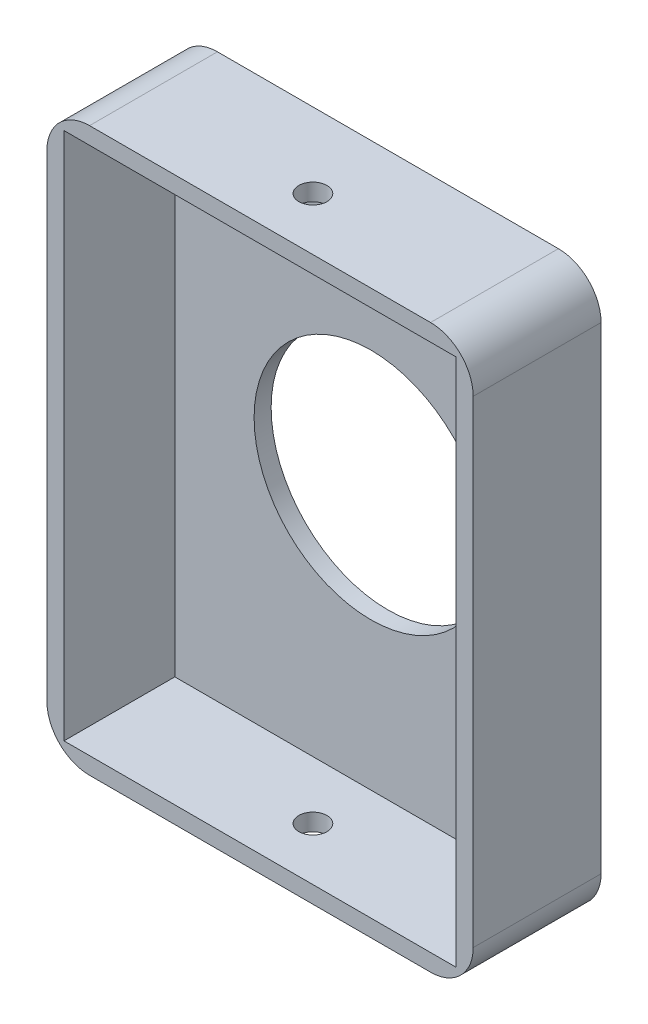
ISO-10303-21;
HEADER;
FILE_DESCRIPTION(('STEP AP214'),'2;1');
FILE_NAME('part.step','',(''),(''),'','','');
FILE_SCHEMA(('AUTOMOTIVE_DESIGN { 1 0 10303 214 1 1 1 1 }'));
ENDSEC;
DATA;
#1=APPLICATION_CONTEXT('core data for automotive mechanical design processes');
#2=APPLICATION_PROTOCOL_DEFINITION('international standard','automotive_design',2000,#1);
#3=PRODUCT_CONTEXT('',#1,'mechanical');
#4=PRODUCT('Part','Part','',(#3));
#5=PRODUCT_RELATED_PRODUCT_CATEGORY('part','',(#4));
#6=PRODUCT_DEFINITION_FORMATION('','',#4);
#7=PRODUCT_DEFINITION_CONTEXT('part definition',#1,'design');
#8=PRODUCT_DEFINITION('design','',#6,#7);
#9=PRODUCT_DEFINITION_SHAPE('','',#8);
#10=(LENGTH_UNIT() NAMED_UNIT(*) SI_UNIT(.MILLI.,.METRE.));
#11=(NAMED_UNIT(*) PLANE_ANGLE_UNIT() SI_UNIT($,.RADIAN.));
#12=(NAMED_UNIT(*) SI_UNIT($,.STERADIAN.) SOLID_ANGLE_UNIT());
#13=UNCERTAINTY_MEASURE_WITH_UNIT(LENGTH_MEASURE(1.E-05),#10,'distance_accuracy_value','');
#14=(GEOMETRIC_REPRESENTATION_CONTEXT(3) GLOBAL_UNCERTAINTY_ASSIGNED_CONTEXT((#13)) GLOBAL_UNIT_ASSIGNED_CONTEXT((#10,
#11,#12)) REPRESENTATION_CONTEXT('',''));
#15=CARTESIAN_POINT('',(0.,0.,0.));
#16=DIRECTION('',(0.,0.,1.));
#17=DIRECTION('',(1.,0.,0.));
#18=AXIS2_PLACEMENT_3D('',#15,#16,#17);
#19=CARTESIAN_POINT('',(0.,0.,19.05));
#20=DIRECTION('',(0.,0.,-1.));
#21=DIRECTION('',(-1.,0.,0.));
#22=AXIS2_PLACEMENT_3D('',#19,#20,#21);
#23=PLANE('',#22);
#24=DIRECTION('',(0.,1.,0.));
#25=VECTOR('',#24,1.);
#26=CARTESIAN_POINT('',(31.75,-41.91,19.05));
#27=LINE('',#26,#25);
#28=CARTESIAN_POINT('',(31.75,-35.56,19.05));
#29=VERTEX_POINT('',#28);
#30=CARTESIAN_POINT('',(31.75,35.56,19.05));
#31=VERTEX_POINT('',#30);
#32=EDGE_CURVE('E176',#29,#31,#27,.T.);
#33=ORIENTED_EDGE('',*,*,#32,.T.);
#34=CARTESIAN_POINT('',(25.4,35.56,19.05));
#35=DIRECTION('',(0.,0.,-1.));
#36=DIRECTION('',(-1.,0.,0.));
#37=AXIS2_PLACEMENT_3D('',#34,#35,#36);
#38=CIRCLE('',#37,6.35);
#39=CARTESIAN_POINT('',(25.4,41.91,19.05));
#40=VERTEX_POINT('',#39);
#41=EDGE_CURVE('E239',#31,#40,#38,.F.);
#42=ORIENTED_EDGE('',*,*,#41,.T.);
#43=DIRECTION('',(-1.,0.,0.));
#44=VECTOR('',#43,1.);
#45=CARTESIAN_POINT('',(-31.75,41.91,19.05));
#46=LINE('',#45,#44);
#47=CARTESIAN_POINT('',(-25.4,41.91,19.05));
#48=VERTEX_POINT('',#47);
#49=EDGE_CURVE('E180',#40,#48,#46,.T.);
#50=ORIENTED_EDGE('',*,*,#49,.T.);
#51=CARTESIAN_POINT('',(-25.4,35.56,19.05));
#52=DIRECTION('',(0.,0.,-1.));
#53=DIRECTION('',(-1.,0.,0.));
#54=AXIS2_PLACEMENT_3D('',#51,#52,#53);
#55=CIRCLE('',#54,6.35);
#56=CARTESIAN_POINT('',(-31.75,35.56,19.05));
#57=VERTEX_POINT('',#56);
#58=EDGE_CURVE('E231',#48,#57,#55,.F.);
#59=ORIENTED_EDGE('',*,*,#58,.T.);
#60=DIRECTION('',(0.,-1.,0.));
#61=VECTOR('',#60,1.);
#62=CARTESIAN_POINT('',(-31.75,-41.91,19.05));
#63=LINE('',#62,#61);
#64=CARTESIAN_POINT('',(-31.75,-35.56,19.05));
#65=VERTEX_POINT('',#64);
#66=EDGE_CURVE('E185',#57,#65,#63,.T.);
#67=ORIENTED_EDGE('',*,*,#66,.T.);
#68=CARTESIAN_POINT('',(-25.4,-35.56,19.05));
#69=DIRECTION('',(0.,0.,-1.));
#70=DIRECTION('',(-1.,0.,0.));
#71=AXIS2_PLACEMENT_3D('',#68,#69,#70);
#72=CIRCLE('',#71,6.35);
#73=CARTESIAN_POINT('',(-25.4,-41.91,19.05));
#74=VERTEX_POINT('',#73);
#75=EDGE_CURVE('E62',#65,#74,#72,.F.);
#76=ORIENTED_EDGE('',*,*,#75,.T.);
#77=DIRECTION('',(1.,0.,0.));
#78=VECTOR('',#77,1.);
#79=CARTESIAN_POINT('',(-31.75,-41.91,19.05));
#80=LINE('',#79,#78);
#81=CARTESIAN_POINT('',(25.4,-41.91,19.05));
#82=VERTEX_POINT('',#81);
#83=EDGE_CURVE('E188',#74,#82,#80,.T.);
#84=ORIENTED_EDGE('',*,*,#83,.T.);
#85=CARTESIAN_POINT('',(25.4,-35.56,19.05));
#86=DIRECTION('',(0.,0.,-1.));
#87=DIRECTION('',(-1.,0.,0.));
#88=AXIS2_PLACEMENT_3D('',#85,#86,#87);
#89=CIRCLE('',#88,6.35);
#90=EDGE_CURVE('E236',#82,#29,#89,.F.);
#91=ORIENTED_EDGE('',*,*,#90,.T.);
#92=EDGE_LOOP('',(#33,#42,#50,#59,#67,#76,#84,#91));
#93=FACE_BOUND('',#92,.T.);
#94=DIRECTION('',(0.,1.,0.));
#95=VECTOR('',#94,1.);
#96=CARTESIAN_POINT('',(29.21,0.,19.05));
#97=LINE('',#96,#95);
#98=CARTESIAN_POINT('',(29.21,-39.37,19.05));
#99=VERTEX_POINT('',#98);
#100=CARTESIAN_POINT('',(29.21,39.37,19.05));
#101=VERTEX_POINT('',#100);
#102=EDGE_CURVE('E160',#99,#101,#97,.T.);
#103=ORIENTED_EDGE('',*,*,#102,.F.);
#104=DIRECTION('',(1.,0.,0.));
#105=VECTOR('',#104,1.);
#106=CARTESIAN_POINT('',(0.,-39.37,19.05));
#107=LINE('',#106,#105);
#108=CARTESIAN_POINT('',(-29.21,-39.37,19.05));
#109=VERTEX_POINT('',#108);
#110=EDGE_CURVE('E173',#109,#99,#107,.T.);
#111=ORIENTED_EDGE('',*,*,#110,.F.);
#112=DIRECTION('',(0.,-1.,0.));
#113=VECTOR('',#112,1.);
#114=CARTESIAN_POINT('',(-29.21,0.,19.05));
#115=LINE('',#114,#113);
#116=CARTESIAN_POINT('',(-29.21,39.37,19.05));
#117=VERTEX_POINT('',#116);
#118=EDGE_CURVE('E170',#117,#109,#115,.T.);
#119=ORIENTED_EDGE('',*,*,#118,.F.);
#120=DIRECTION('',(-1.,0.,0.));
#121=VECTOR('',#120,1.);
#122=CARTESIAN_POINT('',(0.,39.37,19.05));
#123=LINE('',#122,#121);
#124=EDGE_CURVE('E146',#101,#117,#123,.T.);
#125=ORIENTED_EDGE('',*,*,#124,.F.);
#126=EDGE_LOOP('',(#103,#111,#119,#125));
#127=FACE_BOUND('',#126,.T.);
#128=ADVANCED_FACE('F38',(#93,#127),#23,.F.);
#129=CARTESIAN_POINT('',(31.75,-41.91,19.05));
#130=DIRECTION('',(-1.,0.,0.));
#131=DIRECTION('',(0.,0.,1.));
#132=AXIS2_PLACEMENT_3D('',#129,#130,#131);
#133=PLANE('',#132);
#134=DIRECTION('',(0.,1.,0.));
#135=VECTOR('',#134,1.);
#136=CARTESIAN_POINT('',(31.75,-41.91,0.));
#137=LINE('',#136,#135);
#138=CARTESIAN_POINT('',(31.75,-35.56,0.));
#139=VERTEX_POINT('',#138);
#140=CARTESIAN_POINT('',(31.75,35.56,0.));
#141=VERTEX_POINT('',#140);
#142=EDGE_CURVE('E192',#139,#141,#137,.T.);
#143=ORIENTED_EDGE('',*,*,#142,.T.);
#144=DIRECTION('',(0.,0.,-1.));
#145=VECTOR('',#144,1.);
#146=CARTESIAN_POINT('',(31.75,35.56,19.05));
#147=LINE('',#146,#145);
#148=EDGE_CURVE('E228',#141,#31,#147,.F.);
#149=ORIENTED_EDGE('',*,*,#148,.T.);
#150=ORIENTED_EDGE('',*,*,#32,.F.);
#151=DIRECTION('',(0.,0.,-1.));
#152=VECTOR('',#151,1.);
#153=CARTESIAN_POINT('',(31.75,-35.56,19.05));
#154=LINE('',#153,#152);
#155=EDGE_CURVE('E224',#29,#139,#154,.T.);
#156=ORIENTED_EDGE('',*,*,#155,.T.);
#157=EDGE_LOOP('',(#143,#149,#150,#156));
#158=FACE_BOUND('',#157,.T.);
#159=ADVANCED_FACE('F274',(#158),#133,.F.);
#160=CARTESIAN_POINT('',(-31.75,41.91,19.05));
#161=DIRECTION('',(0.,-1.,0.));
#162=DIRECTION('',(0.,0.,-1.));
#163=AXIS2_PLACEMENT_3D('',#160,#161,#162);
#164=PLANE('',#163);
#165=CARTESIAN_POINT('',(0.,41.91,11.176));
#166=DIRECTION('',(0.,-1.,0.));
#167=DIRECTION('',(0.,0.,-1.));
#168=AXIS2_PLACEMENT_3D('',#165,#166,#167);
#169=CIRCLE('',#168,2.0955);
#170=CARTESIAN_POINT('',(0.,41.91,13.2715));
#171=VERTEX_POINT('',#170);
#172=EDGE_CURVE('E453',#171,#171,#169,.T.);
#173=ORIENTED_EDGE('',*,*,#172,.T.);
#174=EDGE_LOOP('',(#173));
#175=FACE_BOUND('',#174,.T.);
#176=ORIENTED_EDGE('',*,*,#49,.F.);
#177=DIRECTION('',(0.,0.,-1.));
#178=VECTOR('',#177,1.);
#179=CARTESIAN_POINT('',(25.4,41.91,19.05));
#180=LINE('',#179,#178);
#181=CARTESIAN_POINT('',(25.4,41.91,0.));
#182=VERTEX_POINT('',#181);
#183=EDGE_CURVE('E208',#40,#182,#180,.T.);
#184=ORIENTED_EDGE('',*,*,#183,.T.);
#185=DIRECTION('',(-1.,0.,0.));
#186=VECTOR('',#185,1.);
#187=CARTESIAN_POINT('',(-31.75,41.91,0.));
#188=LINE('',#187,#186);
#189=CARTESIAN_POINT('',(-25.4,41.91,0.));
#190=VERTEX_POINT('',#189);
#191=EDGE_CURVE('E196',#182,#190,#188,.T.);
#192=ORIENTED_EDGE('',*,*,#191,.T.);
#193=DIRECTION('',(0.,0.,-1.));
#194=VECTOR('',#193,1.);
#195=CARTESIAN_POINT('',(-25.4,41.91,19.05));
#196=LINE('',#195,#194);
#197=EDGE_CURVE('E191',#190,#48,#196,.F.);
#198=ORIENTED_EDGE('',*,*,#197,.T.);
#199=EDGE_LOOP('',(#176,#184,#192,#198));
#200=FACE_BOUND('',#199,.T.);
#201=ADVANCED_FACE('F282',(#175,#200),#164,.F.);
#202=CARTESIAN_POINT('',(-31.75,-41.91,19.05));
#203=DIRECTION('',(1.,0.,0.));
#204=DIRECTION('',(0.,0.,-1.));
#205=AXIS2_PLACEMENT_3D('',#202,#203,#204);
#206=PLANE('',#205);
#207=DIRECTION('',(0.,-1.,0.));
#208=VECTOR('',#207,1.);
#209=CARTESIAN_POINT('',(-31.75,-41.91,0.));
#210=LINE('',#209,#208);
#211=CARTESIAN_POINT('',(-31.75,35.56,0.));
#212=VERTEX_POINT('',#211);
#213=CARTESIAN_POINT('',(-31.75,-35.56,0.));
#214=VERTEX_POINT('',#213);
#215=EDGE_CURVE('E200',#212,#214,#210,.T.);
#216=ORIENTED_EDGE('',*,*,#215,.T.);
#217=DIRECTION('',(0.,0.,-1.));
#218=VECTOR('',#217,1.);
#219=CARTESIAN_POINT('',(-31.75,-35.56,19.05));
#220=LINE('',#219,#218);
#221=EDGE_CURVE('E11',#214,#65,#220,.F.);
#222=ORIENTED_EDGE('',*,*,#221,.T.);
#223=ORIENTED_EDGE('',*,*,#66,.F.);
#224=DIRECTION('',(0.,0.,-1.));
#225=VECTOR('',#224,1.);
#226=CARTESIAN_POINT('',(-31.75,35.56,19.05));
#227=LINE('',#226,#225);
#228=EDGE_CURVE('E48',#57,#212,#227,.T.);
#229=ORIENTED_EDGE('',*,*,#228,.T.);
#230=EDGE_LOOP('',(#216,#222,#223,#229));
#231=FACE_BOUND('',#230,.T.);
#232=ADVANCED_FACE('F254',(#231),#206,.F.);
#233=CARTESIAN_POINT('',(-31.75,-41.91,19.05));
#234=DIRECTION('',(0.,1.,0.));
#235=DIRECTION('',(0.,0.,1.));
#236=AXIS2_PLACEMENT_3D('',#233,#234,#235);
#237=PLANE('',#236);
#238=CARTESIAN_POINT('',(0.,-41.91,11.176));
#239=DIRECTION('',(0.,1.,0.));
#240=DIRECTION('',(0.,0.,1.));
#241=AXIS2_PLACEMENT_3D('',#238,#239,#240);
#242=CIRCLE('',#241,2.0955);
#243=CARTESIAN_POINT('',(0.,-41.91,13.2715));
#244=VERTEX_POINT('',#243);
#245=EDGE_CURVE('E471',#244,#244,#242,.T.);
#246=ORIENTED_EDGE('',*,*,#245,.T.);
#247=EDGE_LOOP('',(#246));
#248=FACE_BOUND('',#247,.T.);
#249=DIRECTION('',(1.,0.,0.));
#250=VECTOR('',#249,1.);
#251=CARTESIAN_POINT('',(-31.75,-41.91,0.));
#252=LINE('',#251,#250);
#253=CARTESIAN_POINT('',(-25.4,-41.91,0.));
#254=VERTEX_POINT('',#253);
#255=CARTESIAN_POINT('',(25.4,-41.91,0.));
#256=VERTEX_POINT('',#255);
#257=EDGE_CURVE('E181',#254,#256,#252,.T.);
#258=ORIENTED_EDGE('',*,*,#257,.T.);
#259=DIRECTION('',(0.,0.,-1.));
#260=VECTOR('',#259,1.);
#261=CARTESIAN_POINT('',(25.4,-41.91,19.05));
#262=LINE('',#261,#260);
#263=EDGE_CURVE('E55',#256,#82,#262,.F.);
#264=ORIENTED_EDGE('',*,*,#263,.T.);
#265=ORIENTED_EDGE('',*,*,#83,.F.);
#266=DIRECTION('',(0.,0.,-1.));
#267=VECTOR('',#266,1.);
#268=CARTESIAN_POINT('',(-25.4,-41.91,19.05));
#269=LINE('',#268,#267);
#270=EDGE_CURVE('E242',#74,#254,#269,.T.);
#271=ORIENTED_EDGE('',*,*,#270,.T.);
#272=EDGE_LOOP('',(#258,#264,#265,#271));
#273=FACE_BOUND('',#272,.T.);
#274=ADVANCED_FACE('F265',(#248,#273),#237,.F.);
#275=CARTESIAN_POINT('',(0.,0.,0.));
#276=DIRECTION('',(0.,0.,-1.));
#277=DIRECTION('',(-1.,0.,0.));
#278=AXIS2_PLACEMENT_3D('',#275,#276,#277);
#279=PLANE('',#278);
#280=CARTESIAN_POINT('',(0.,0.,0.));
#281=DIRECTION('',(0.,0.,-1.));
#282=DIRECTION('',(-1.,0.,0.));
#283=AXIS2_PLACEMENT_3D('',#280,#281,#282);
#284=CIRCLE('',#283,17.399);
#285=CARTESIAN_POINT('',(-17.399,0.,0.));
#286=VERTEX_POINT('',#285);
#287=EDGE_CURVE('E447',#286,#286,#284,.F.);
#288=ORIENTED_EDGE('',*,*,#287,.T.);
#289=EDGE_LOOP('',(#288));
#290=FACE_BOUND('',#289,.T.);
#291=ORIENTED_EDGE('',*,*,#191,.F.);
#292=CARTESIAN_POINT('',(25.4,35.56,0.));
#293=DIRECTION('',(0.,0.,-1.));
#294=DIRECTION('',(-1.,0.,0.));
#295=AXIS2_PLACEMENT_3D('',#292,#293,#294);
#296=CIRCLE('',#295,6.35);
#297=EDGE_CURVE('E221',#182,#141,#296,.T.);
#298=ORIENTED_EDGE('',*,*,#297,.T.);
#299=ORIENTED_EDGE('',*,*,#142,.F.);
#300=CARTESIAN_POINT('',(25.4,-35.56,0.));
#301=DIRECTION('',(0.,0.,-1.));
#302=DIRECTION('',(-1.,0.,0.));
#303=AXIS2_PLACEMENT_3D('',#300,#301,#302);
#304=CIRCLE('',#303,6.35);
#305=EDGE_CURVE('E218',#139,#256,#304,.T.);
#306=ORIENTED_EDGE('',*,*,#305,.T.);
#307=ORIENTED_EDGE('',*,*,#257,.F.);
#308=CARTESIAN_POINT('',(-25.4,-35.56,0.));
#309=DIRECTION('',(0.,0.,-1.));
#310=DIRECTION('',(-1.,0.,0.));
#311=AXIS2_PLACEMENT_3D('',#308,#309,#310);
#312=CIRCLE('',#311,6.35);
#313=EDGE_CURVE('E215',#254,#214,#312,.T.);
#314=ORIENTED_EDGE('',*,*,#313,.T.);
#315=ORIENTED_EDGE('',*,*,#215,.F.);
#316=CARTESIAN_POINT('',(-25.4,35.56,0.));
#317=DIRECTION('',(0.,0.,-1.));
#318=DIRECTION('',(-1.,0.,0.));
#319=AXIS2_PLACEMENT_3D('',#316,#317,#318);
#320=CIRCLE('',#319,6.35);
#321=EDGE_CURVE('E212',#212,#190,#320,.T.);
#322=ORIENTED_EDGE('',*,*,#321,.T.);
#323=EDGE_LOOP('',(#291,#298,#299,#306,#307,#314,#315,#322));
#324=FACE_BOUND('',#323,.T.);
#325=ADVANCED_FACE('F260',(#290,#324),#279,.T.);
#326=CARTESIAN_POINT('',(29.21,-41.91,19.05));
#327=DIRECTION('',(-1.,0.,0.));
#328=DIRECTION('',(0.,0.,1.));
#329=AXIS2_PLACEMENT_3D('',#326,#327,#328);
#330=PLANE('',#329);
#331=DIRECTION('',(0.,1.,0.));
#332=VECTOR('',#331,1.);
#333=CARTESIAN_POINT('',(29.21,0.,2.54));
#334=LINE('',#333,#332);
#335=CARTESIAN_POINT('',(29.21,-39.37,2.54));
#336=VERTEX_POINT('',#335);
#337=CARTESIAN_POINT('',(29.21,39.37,2.54));
#338=VERTEX_POINT('',#337);
#339=EDGE_CURVE('E136',#336,#338,#334,.T.);
#340=ORIENTED_EDGE('',*,*,#339,.F.);
#341=DIRECTION('',(0.,0.,-1.));
#342=VECTOR('',#341,1.);
#343=CARTESIAN_POINT('',(29.21,-39.37,19.05));
#344=LINE('',#343,#342);
#345=EDGE_CURVE('E164',#99,#336,#344,.T.);
#346=ORIENTED_EDGE('',*,*,#345,.F.);
#347=ORIENTED_EDGE('',*,*,#102,.T.);
#348=DIRECTION('',(0.,0.,-1.));
#349=VECTOR('',#348,1.);
#350=CARTESIAN_POINT('',(29.21,39.37,19.05));
#351=LINE('',#350,#349);
#352=EDGE_CURVE('E151',#101,#338,#351,.T.);
#353=ORIENTED_EDGE('',*,*,#352,.T.);
#354=EDGE_LOOP('',(#340,#346,#347,#353));
#355=FACE_BOUND('',#354,.T.);
#356=ADVANCED_FACE('F304',(#355),#330,.T.);
#357=CARTESIAN_POINT('',(-31.75,39.37,19.05));
#358=DIRECTION('',(0.,-1.,0.));
#359=DIRECTION('',(0.,0.,-1.));
#360=AXIS2_PLACEMENT_3D('',#357,#358,#359);
#361=PLANE('',#360);
#362=CARTESIAN_POINT('',(0.,39.37,11.176));
#363=DIRECTION('',(0.,-1.,0.));
#364=DIRECTION('',(0.,0.,-1.));
#365=AXIS2_PLACEMENT_3D('',#362,#363,#364);
#366=CIRCLE('',#365,2.0955);
#367=CARTESIAN_POINT('',(0.,39.37,13.2715));
#368=VERTEX_POINT('',#367);
#369=EDGE_CURVE('E468',#368,#368,#366,.T.);
#370=ORIENTED_EDGE('',*,*,#369,.F.);
#371=EDGE_LOOP('',(#370));
#372=FACE_BOUND('',#371,.T.);
#373=DIRECTION('',(-1.,0.,0.));
#374=VECTOR('',#373,1.);
#375=CARTESIAN_POINT('',(0.,39.37,2.54));
#376=LINE('',#375,#374);
#377=CARTESIAN_POINT('',(-29.21,39.37,2.54));
#378=VERTEX_POINT('',#377);
#379=EDGE_CURVE('E129',#338,#378,#376,.T.);
#380=ORIENTED_EDGE('',*,*,#379,.F.);
#381=ORIENTED_EDGE('',*,*,#352,.F.);
#382=ORIENTED_EDGE('',*,*,#124,.T.);
#383=DIRECTION('',(0.,0.,-1.));
#384=VECTOR('',#383,1.);
#385=CARTESIAN_POINT('',(-29.21,39.37,19.05));
#386=LINE('',#385,#384);
#387=EDGE_CURVE('E143',#117,#378,#386,.T.);
#388=ORIENTED_EDGE('',*,*,#387,.T.);
#389=EDGE_LOOP('',(#380,#381,#382,#388));
#390=FACE_BOUND('',#389,.T.);
#391=ADVANCED_FACE('F144',(#372,#390),#361,.T.);
#392=CARTESIAN_POINT('',(-29.21,-41.91,19.05));
#393=DIRECTION('',(1.,0.,0.));
#394=DIRECTION('',(0.,0.,-1.));
#395=AXIS2_PLACEMENT_3D('',#392,#393,#394);
#396=PLANE('',#395);
#397=DIRECTION('',(0.,-1.,0.));
#398=VECTOR('',#397,1.);
#399=CARTESIAN_POINT('',(-29.21,0.,2.54));
#400=LINE('',#399,#398);
#401=CARTESIAN_POINT('',(-29.21,-39.37,2.54));
#402=VERTEX_POINT('',#401);
#403=EDGE_CURVE('E133',#378,#402,#400,.T.);
#404=ORIENTED_EDGE('',*,*,#403,.F.);
#405=ORIENTED_EDGE('',*,*,#387,.F.);
#406=ORIENTED_EDGE('',*,*,#118,.T.);
#407=DIRECTION('',(0.,0.,-1.));
#408=VECTOR('',#407,1.);
#409=CARTESIAN_POINT('',(-29.21,-39.37,19.05));
#410=LINE('',#409,#408);
#411=EDGE_CURVE('E152',#109,#402,#410,.T.);
#412=ORIENTED_EDGE('',*,*,#411,.T.);
#413=EDGE_LOOP('',(#404,#405,#406,#412));
#414=FACE_BOUND('',#413,.T.);
#415=ADVANCED_FACE('F154',(#414),#396,.T.);
#416=CARTESIAN_POINT('',(-31.75,-39.37,19.05));
#417=DIRECTION('',(0.,1.,0.));
#418=DIRECTION('',(0.,0.,1.));
#419=AXIS2_PLACEMENT_3D('',#416,#417,#418);
#420=PLANE('',#419);
#421=CARTESIAN_POINT('',(0.,-39.37,11.176));
#422=DIRECTION('',(0.,1.,0.));
#423=DIRECTION('',(0.,0.,1.));
#424=AXIS2_PLACEMENT_3D('',#421,#422,#423);
#425=CIRCLE('',#424,2.0955);
#426=CARTESIAN_POINT('',(0.,-39.37,13.2715));
#427=VERTEX_POINT('',#426);
#428=EDGE_CURVE('E42',#427,#427,#425,.T.);
#429=ORIENTED_EDGE('',*,*,#428,.F.);
#430=EDGE_LOOP('',(#429));
#431=FACE_BOUND('',#430,.T.);
#432=DIRECTION('',(1.,0.,0.));
#433=VECTOR('',#432,1.);
#434=CARTESIAN_POINT('',(0.,-39.37,2.54));
#435=LINE('',#434,#433);
#436=EDGE_CURVE('E157',#402,#336,#435,.T.);
#437=ORIENTED_EDGE('',*,*,#436,.F.);
#438=ORIENTED_EDGE('',*,*,#411,.F.);
#439=ORIENTED_EDGE('',*,*,#110,.T.);
#440=ORIENTED_EDGE('',*,*,#345,.T.);
#441=EDGE_LOOP('',(#437,#438,#439,#440));
#442=FACE_BOUND('',#441,.T.);
#443=ADVANCED_FACE('F354',(#431,#442),#420,.T.);
#444=CARTESIAN_POINT('',(0.,0.,2.54));
#445=DIRECTION('',(0.,0.,-1.));
#446=DIRECTION('',(-1.,0.,0.));
#447=AXIS2_PLACEMENT_3D('',#444,#445,#446);
#448=PLANE('',#447);
#449=CARTESIAN_POINT('',(0.,0.,2.54));
#450=DIRECTION('',(0.,0.,1.));
#451=DIRECTION('',(1.,0.,0.));
#452=AXIS2_PLACEMENT_3D('',#449,#450,#451);
#453=CIRCLE('',#452,17.399);
#454=CARTESIAN_POINT('',(17.399,0.,2.54));
#455=VERTEX_POINT('',#454);
#456=EDGE_CURVE('E444',#455,#455,#453,.T.);
#457=ORIENTED_EDGE('',*,*,#456,.F.);
#458=EDGE_LOOP('',(#457));
#459=FACE_BOUND('',#458,.T.);
#460=ORIENTED_EDGE('',*,*,#339,.T.);
#461=ORIENTED_EDGE('',*,*,#379,.T.);
#462=ORIENTED_EDGE('',*,*,#403,.T.);
#463=ORIENTED_EDGE('',*,*,#436,.T.);
#464=EDGE_LOOP('',(#460,#461,#462,#463));
#465=FACE_BOUND('',#464,.T.);
#466=ADVANCED_FACE('F131',(#459,#465),#448,.F.);
#467=CARTESIAN_POINT('',(0.,0.,-0.00100000000000013));
#468=DIRECTION('',(0.,0.,1.));
#469=DIRECTION('',(1.,0.,0.));
#470=AXIS2_PLACEMENT_3D('',#467,#468,#469);
#471=CYLINDRICAL_SURFACE('',#470,17.399);
#472=ORIENTED_EDGE('',*,*,#287,.F.);
#473=EDGE_LOOP('',(#472));
#474=FACE_BOUND('',#473,.T.);
#475=ORIENTED_EDGE('',*,*,#456,.T.);
#476=EDGE_LOOP('',(#475));
#477=FACE_BOUND('',#476,.T.);
#478=ADVANCED_FACE('F316',(#474,#477),#471,.F.);
#479=CARTESIAN_POINT('',(25.4,35.56,19.05));
#480=DIRECTION('',(0.,0.,-1.));
#481=DIRECTION('',(-1.,0.,0.));
#482=AXIS2_PLACEMENT_3D('',#479,#480,#481);
#483=CYLINDRICAL_SURFACE('',#482,6.35);
#484=ORIENTED_EDGE('',*,*,#41,.F.);
#485=ORIENTED_EDGE('',*,*,#148,.F.);
#486=ORIENTED_EDGE('',*,*,#297,.F.);
#487=ORIENTED_EDGE('',*,*,#183,.F.);
#488=EDGE_LOOP('',(#484,#485,#486,#487));
#489=FACE_BOUND('',#488,.T.);
#490=ADVANCED_FACE('F279',(#489),#483,.T.);
#491=CARTESIAN_POINT('',(25.4,-35.56,19.05));
#492=DIRECTION('',(0.,0.,-1.));
#493=DIRECTION('',(-1.,0.,0.));
#494=AXIS2_PLACEMENT_3D('',#491,#492,#493);
#495=CYLINDRICAL_SURFACE('',#494,6.35);
#496=ORIENTED_EDGE('',*,*,#90,.F.);
#497=ORIENTED_EDGE('',*,*,#263,.F.);
#498=ORIENTED_EDGE('',*,*,#305,.F.);
#499=ORIENTED_EDGE('',*,*,#155,.F.);
#500=EDGE_LOOP('',(#496,#497,#498,#499));
#501=FACE_BOUND('',#500,.T.);
#502=ADVANCED_FACE('F271',(#501),#495,.T.);
#503=CARTESIAN_POINT('',(-25.4,-35.56,19.05));
#504=DIRECTION('',(0.,0.,-1.));
#505=DIRECTION('',(-1.,0.,0.));
#506=AXIS2_PLACEMENT_3D('',#503,#504,#505);
#507=CYLINDRICAL_SURFACE('',#506,6.35);
#508=ORIENTED_EDGE('',*,*,#75,.F.);
#509=ORIENTED_EDGE('',*,*,#221,.F.);
#510=ORIENTED_EDGE('',*,*,#313,.F.);
#511=ORIENTED_EDGE('',*,*,#270,.F.);
#512=EDGE_LOOP('',(#508,#509,#510,#511));
#513=FACE_BOUND('',#512,.T.);
#514=ADVANCED_FACE('F264',(#513),#507,.T.);
#515=CARTESIAN_POINT('',(-25.4,35.56,19.05));
#516=DIRECTION('',(0.,0.,-1.));
#517=DIRECTION('',(-1.,0.,0.));
#518=AXIS2_PLACEMENT_3D('',#515,#516,#517);
#519=CYLINDRICAL_SURFACE('',#518,6.35);
#520=ORIENTED_EDGE('',*,*,#58,.F.);
#521=ORIENTED_EDGE('',*,*,#197,.F.);
#522=ORIENTED_EDGE('',*,*,#321,.F.);
#523=ORIENTED_EDGE('',*,*,#228,.F.);
#524=EDGE_LOOP('',(#520,#521,#522,#523));
#525=FACE_BOUND('',#524,.T.);
#526=ADVANCED_FACE('F40',(#525),#519,.T.);
#527=CARTESIAN_POINT('',(0.,-41.91,11.176));
#528=DIRECTION('',(0.,1.,0.));
#529=DIRECTION('',(0.,0.,1.));
#530=AXIS2_PLACEMENT_3D('',#527,#528,#529);
#531=CYLINDRICAL_SURFACE('',#530,2.0955);
#532=ORIENTED_EDGE('',*,*,#428,.T.);
#533=EDGE_LOOP('',(#532));
#534=FACE_BOUND('',#533,.T.);
#535=ORIENTED_EDGE('',*,*,#245,.F.);
#536=EDGE_LOOP('',(#535));
#537=FACE_BOUND('',#536,.T.);
#538=ADVANCED_FACE('F285',(#534,#537),#531,.F.);
#539=CARTESIAN_POINT('',(0.,39.37,13.2715));
#540=CARTESIAN_POINT('',(0.,39.3964583333333,13.2715));
#541=CARTESIAN_POINT('',(0.,39.4229166666667,13.2715));
#542=CARTESIAN_POINT('',(0.,39.4758333333333,13.2715));
#543=CARTESIAN_POINT('',(0.,39.5022916666667,13.2715));
#544=CARTESIAN_POINT('',(0.,39.5552083333333,13.2715));
#545=CARTESIAN_POINT('',(0.,39.5816666666667,13.2715));
#546=CARTESIAN_POINT('',(0.,39.6345833333333,13.2715));
#547=CARTESIAN_POINT('',(0.,39.6610416666667,13.2715));
#548=CARTESIAN_POINT('',(0.,39.7139583333333,13.2715));
#549=CARTESIAN_POINT('',(0.,39.7404166666667,13.2715));
#550=CARTESIAN_POINT('',(0.,39.7933333333333,13.2715));
#551=CARTESIAN_POINT('',(0.,39.8197916666667,13.2715));
#552=CARTESIAN_POINT('',(0.,39.8727083333333,13.2715));
#553=CARTESIAN_POINT('',(0.,39.8991666666667,13.2715));
#554=CARTESIAN_POINT('',(0.,39.9520833333333,13.2715));
#555=CARTESIAN_POINT('',(0.,39.9785416666667,13.2715));
#556=CARTESIAN_POINT('',(0.,40.0314583333333,13.2715));
#557=CARTESIAN_POINT('',(0.,40.0579166666667,13.2715));
#558=CARTESIAN_POINT('',(0.,40.1108333333333,13.2715));
#559=CARTESIAN_POINT('',(0.,40.1372916666667,13.2715));
#560=CARTESIAN_POINT('',(0.,40.1902083333333,13.2715));
#561=CARTESIAN_POINT('',(0.,40.2166666666667,13.2715));
#562=CARTESIAN_POINT('',(0.,40.2695833333333,13.2715));
#563=CARTESIAN_POINT('',(0.,40.2960416666667,13.2715));
#564=CARTESIAN_POINT('',(0.,40.3489583333333,13.2715));
#565=CARTESIAN_POINT('',(0.,40.3754166666667,13.2715));
#566=CARTESIAN_POINT('',(0.,40.4283333333333,13.2715));
#567=CARTESIAN_POINT('',(0.,40.4547916666667,13.2715));
#568=CARTESIAN_POINT('',(0.,40.5077083333333,13.2715));
#569=CARTESIAN_POINT('',(0.,40.5341666666667,13.2715));
#570=CARTESIAN_POINT('',(0.,40.5870833333333,13.2715));
#571=CARTESIAN_POINT('',(0.,40.6135416666667,13.2715));
#572=CARTESIAN_POINT('',(0.,40.6664583333333,13.2715));
#573=CARTESIAN_POINT('',(0.,40.6929166666667,13.2715));
#574=CARTESIAN_POINT('',(0.,40.7458333333334,13.2715));
#575=CARTESIAN_POINT('',(0.,40.7722916666667,13.2715));
#576=CARTESIAN_POINT('',(0.,40.8252083333333,13.2715));
#577=CARTESIAN_POINT('',(0.,40.8516666666667,13.2715));
#578=CARTESIAN_POINT('',(0.,40.9045833333333,13.2715));
#579=CARTESIAN_POINT('',(0.,40.9310416666667,13.2715));
#580=CARTESIAN_POINT('',(0.,40.9839583333333,13.2715));
#581=CARTESIAN_POINT('',(0.,41.0104166666667,13.2715));
#582=CARTESIAN_POINT('',(0.,41.0633333333333,13.2715));
#583=CARTESIAN_POINT('',(0.,41.0897916666667,13.2715));
#584=CARTESIAN_POINT('',(0.,41.1427083333333,13.2715));
#585=CARTESIAN_POINT('',(0.,41.1691666666667,13.2715));
#586=CARTESIAN_POINT('',(0.,41.2220833333333,13.2715));
#587=CARTESIAN_POINT('',(0.,41.2485416666667,13.2715));
#588=CARTESIAN_POINT('',(0.,41.3014583333334,13.2715));
#589=CARTESIAN_POINT('',(0.,41.3279166666667,13.2715));
#590=CARTESIAN_POINT('',(0.,41.3808333333333,13.2715));
#591=CARTESIAN_POINT('',(0.,41.4072916666667,13.2715));
#592=CARTESIAN_POINT('',(0.,41.4602083333334,13.2715));
#593=CARTESIAN_POINT('',(0.,41.4866666666667,13.2715));
#594=CARTESIAN_POINT('',(0.,41.5395833333333,13.2715));
#595=CARTESIAN_POINT('',(0.,41.5660416666667,13.2715));
#596=CARTESIAN_POINT('',(0.,41.6189583333334,13.2715));
#597=CARTESIAN_POINT('',(0.,41.6454166666667,13.2715));
#598=CARTESIAN_POINT('',(0.,41.6983333333333,13.2715));
#599=CARTESIAN_POINT('',(0.,41.7247916666667,13.2715));
#600=CARTESIAN_POINT('',(0.,41.7777083333334,13.2715));
#601=CARTESIAN_POINT('',(0.,41.8041666666667,13.2715));
#602=CARTESIAN_POINT('',(0.,41.8570833333333,13.2715));
#603=CARTESIAN_POINT('',(0.,41.8835416666667,13.2715));
#604=CARTESIAN_POINT('',(0.,41.91,13.2715));
#605=B_SPLINE_CURVE_WITH_KNOTS('',3,(#539,#540,#541,#542,#543,#544,#545,#546,#547,#548,#549,
#550,#551,#552,#553,#554,#555,#556,#557,#558,#559,#560,#561,#562,#563,#564,#565,#566,#567,#568,
#569,#570,#571,#572,#573,#574,#575,#576,#577,#578,#579,#580,#581,#582,#583,#584,#585,#586,#587,
#588,#589,#590,#591,#592,#593,#594,#595,#596,#597,#598,#599,#600,#601,#602,#603,#604),
.UNSPECIFIED.,.F.,.F.,(4,2,2,2,2,2,2,2,2,2,2,2,2,2,2,2,2,2,2,2,2,2,2,2,2,2,2,2,2,2,2,2,4),(0.,
0.0793750000000065,0.158749999999999,0.238125000000006,0.317499999999998,0.396875000000005,
0.476249999999998,0.555625000000004,0.634999999999997,0.714375000000003,0.79375000000001,
0.873125000000002,0.952500000000009,1.031875,1.11125000000001,1.190625,1.27000000000001,
1.34937500000001,1.42875000000001,1.50812500000001,1.58750000000001,1.66687500000001,1.74625,
1.82562500000001,1.90500000000002,1.98437500000001,2.06375000000002,2.14312500000001,
2.22250000000002,2.30187500000001,2.38125000000002,2.46062500000001,2.54000000000001),.UNSPECIFIED.);
#606=EDGE_CURVE('BSEAM290',#368,#171,#605,.T.);
#607=ORIENTED_EDGE('',*,*,#369,.T.);
#608=ORIENTED_EDGE('',*,*,#172,.F.);
#609=ORIENTED_EDGE('',*,*,#606,.T.);
#610=ORIENTED_EDGE('',*,*,#606,.F.);
#611=EDGE_LOOP('',(#607,#609,#608,#610));
#612=FACE_BOUND('',#611,.T.);
#613=ADVANCED_FACE('F290',(#612),#531,.F.);
#614=CLOSED_SHELL('',(#128,#159,#201,#232,#274,#325,#356,#391,#415,#443,#466,#478,#490,#502,
#514,#526,#538,#613));
#615=MANIFOLD_SOLID_BREP('B2',#614);
#616=ADVANCED_BREP_SHAPE_REPRESENTATION('',(#18,#615),#14);
#617=SHAPE_DEFINITION_REPRESENTATION(#9,#616);
ENDSEC;
END-ISO-10303-21;
